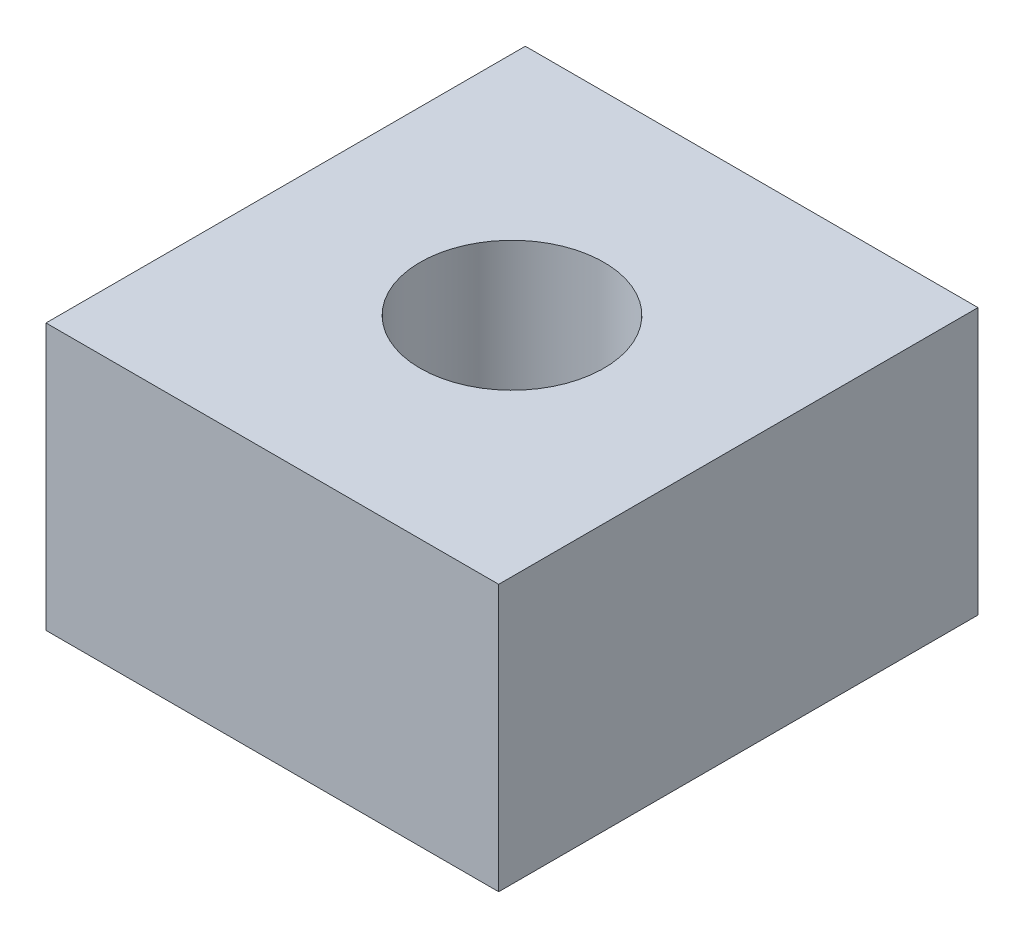
ISO-10303-21;
HEADER;
FILE_DESCRIPTION(('STEP AP214'),'2;1');
FILE_NAME('part.step','',(''),(''),'','','');
FILE_SCHEMA(('AUTOMOTIVE_DESIGN { 1 0 10303 214 1 1 1 1 }'));
ENDSEC;
DATA;
#1=APPLICATION_CONTEXT('core data for automotive mechanical design processes');
#2=APPLICATION_PROTOCOL_DEFINITION('international standard','automotive_design',2000,#1);
#3=PRODUCT_CONTEXT('',#1,'mechanical');
#4=PRODUCT('Part','Part','',(#3));
#5=PRODUCT_RELATED_PRODUCT_CATEGORY('part','',(#4));
#6=PRODUCT_DEFINITION_FORMATION('','',#4);
#7=PRODUCT_DEFINITION_CONTEXT('part definition',#1,'design');
#8=PRODUCT_DEFINITION('design','',#6,#7);
#9=PRODUCT_DEFINITION_SHAPE('','',#8);
#10=(LENGTH_UNIT() NAMED_UNIT(*) SI_UNIT(.MILLI.,.METRE.));
#11=(NAMED_UNIT(*) PLANE_ANGLE_UNIT() SI_UNIT($,.RADIAN.));
#12=(NAMED_UNIT(*) SI_UNIT($,.STERADIAN.) SOLID_ANGLE_UNIT());
#13=UNCERTAINTY_MEASURE_WITH_UNIT(LENGTH_MEASURE(1.E-05),#10,'distance_accuracy_value','');
#14=(GEOMETRIC_REPRESENTATION_CONTEXT(3) GLOBAL_UNCERTAINTY_ASSIGNED_CONTEXT((#13)) GLOBAL_UNIT_ASSIGNED_CONTEXT((#10,
#11,#12)) REPRESENTATION_CONTEXT('',''));
#15=CARTESIAN_POINT('',(0.,0.,0.));
#16=DIRECTION('',(0.,0.,1.));
#17=DIRECTION('',(1.,0.,0.));
#18=AXIS2_PLACEMENT_3D('',#15,#16,#17);
#19=CARTESIAN_POINT('',(0.,10.,0.));
#20=DIRECTION('',(1.,0.,0.));
#21=DIRECTION('',(0.,0.,-1.));
#22=AXIS2_PLACEMENT_3D('',#19,#20,#21);
#23=PLANE('',#22);
#24=DIRECTION('',(0.,0.,1.));
#25=VECTOR('',#24,1.);
#26=CARTESIAN_POINT('',(0.,0.,0.));
#27=LINE('',#26,#25);
#28=CARTESIAN_POINT('',(0.,0.,-18.));
#29=VERTEX_POINT('',#28);
#30=CARTESIAN_POINT('',(0.,0.,0.));
#31=VERTEX_POINT('',#30);
#32=EDGE_CURVE('E97',#29,#31,#27,.T.);
#33=ORIENTED_EDGE('',*,*,#32,.T.);
#34=DIRECTION('',(0.,-1.,0.));
#35=VECTOR('',#34,1.);
#36=CARTESIAN_POINT('',(0.,10.,0.));
#37=LINE('',#36,#35);
#38=CARTESIAN_POINT('',(0.,10.,0.));
#39=VERTEX_POINT('',#38);
#40=EDGE_CURVE('E11',#39,#31,#37,.T.);
#41=ORIENTED_EDGE('',*,*,#40,.F.);
#42=DIRECTION('',(0.,0.,1.));
#43=VECTOR('',#42,1.);
#44=CARTESIAN_POINT('',(0.,10.,0.));
#45=LINE('',#44,#43);
#46=CARTESIAN_POINT('',(0.,10.,-18.));
#47=VERTEX_POINT('',#46);
#48=EDGE_CURVE('E85',#47,#39,#45,.T.);
#49=ORIENTED_EDGE('',*,*,#48,.F.);
#50=DIRECTION('',(0.,-1.,0.));
#51=VECTOR('',#50,1.);
#52=CARTESIAN_POINT('',(0.,10.,-18.));
#53=LINE('',#52,#51);
#54=EDGE_CURVE('E93',#47,#29,#53,.T.);
#55=ORIENTED_EDGE('',*,*,#54,.T.);
#56=EDGE_LOOP('',(#33,#41,#49,#55));
#57=FACE_BOUND('',#56,.T.);
#58=ADVANCED_FACE('F34',(#57),#23,.F.);
#59=CARTESIAN_POINT('',(0.,10.,0.));
#60=DIRECTION('',(0.,0.,-1.));
#61=DIRECTION('',(-1.,0.,0.));
#62=AXIS2_PLACEMENT_3D('',#59,#60,#61);
#63=PLANE('',#62);
#64=DIRECTION('',(1.,0.,0.));
#65=VECTOR('',#64,1.);
#66=CARTESIAN_POINT('',(0.,0.,0.));
#67=LINE('',#66,#65);
#68=CARTESIAN_POINT('',(17.,0.,0.));
#69=VERTEX_POINT('',#68);
#70=EDGE_CURVE('E89',#31,#69,#67,.T.);
#71=ORIENTED_EDGE('',*,*,#70,.T.);
#72=DIRECTION('',(0.,-1.,0.));
#73=VECTOR('',#72,1.);
#74=CARTESIAN_POINT('',(17.,10.,0.));
#75=LINE('',#74,#73);
#76=CARTESIAN_POINT('',(17.,10.,0.));
#77=VERTEX_POINT('',#76);
#78=EDGE_CURVE('E42',#77,#69,#75,.T.);
#79=ORIENTED_EDGE('',*,*,#78,.F.);
#80=DIRECTION('',(1.,0.,0.));
#81=VECTOR('',#80,1.);
#82=CARTESIAN_POINT('',(0.,10.,0.));
#83=LINE('',#82,#81);
#84=EDGE_CURVE('E80',#39,#77,#83,.T.);
#85=ORIENTED_EDGE('',*,*,#84,.F.);
#86=ORIENTED_EDGE('',*,*,#40,.T.);
#87=EDGE_LOOP('',(#71,#79,#85,#86));
#88=FACE_BOUND('',#87,.T.);
#89=ADVANCED_FACE('F88',(#88),#63,.F.);
#90=CARTESIAN_POINT('',(17.,10.,0.));
#91=DIRECTION('',(-1.,0.,0.));
#92=DIRECTION('',(0.,0.,1.));
#93=AXIS2_PLACEMENT_3D('',#90,#91,#92);
#94=PLANE('',#93);
#95=DIRECTION('',(0.,0.,-1.));
#96=VECTOR('',#95,1.);
#97=CARTESIAN_POINT('',(17.,0.,0.));
#98=LINE('',#97,#96);
#99=CARTESIAN_POINT('',(17.,0.,-18.));
#100=VERTEX_POINT('',#99);
#101=EDGE_CURVE('E67',#69,#100,#98,.T.);
#102=ORIENTED_EDGE('',*,*,#101,.T.);
#103=DIRECTION('',(0.,-1.,0.));
#104=VECTOR('',#103,1.);
#105=CARTESIAN_POINT('',(17.,10.,-18.));
#106=LINE('',#105,#104);
#107=CARTESIAN_POINT('',(17.,10.,-18.));
#108=VERTEX_POINT('',#107);
#109=EDGE_CURVE('E90',#108,#100,#106,.T.);
#110=ORIENTED_EDGE('',*,*,#109,.F.);
#111=DIRECTION('',(0.,0.,-1.));
#112=VECTOR('',#111,1.);
#113=CARTESIAN_POINT('',(17.,10.,0.));
#114=LINE('',#113,#112);
#115=EDGE_CURVE('E83',#77,#108,#114,.T.);
#116=ORIENTED_EDGE('',*,*,#115,.F.);
#117=ORIENTED_EDGE('',*,*,#78,.T.);
#118=EDGE_LOOP('',(#102,#110,#116,#117));
#119=FACE_BOUND('',#118,.T.);
#120=ADVANCED_FACE('F91',(#119),#94,.F.);
#121=CARTESIAN_POINT('',(0.,10.,-18.));
#122=DIRECTION('',(0.,0.,1.));
#123=DIRECTION('',(1.,0.,0.));
#124=AXIS2_PLACEMENT_3D('',#121,#122,#123);
#125=PLANE('',#124);
#126=DIRECTION('',(-1.,0.,0.));
#127=VECTOR('',#126,1.);
#128=CARTESIAN_POINT('',(0.,0.,-18.));
#129=LINE('',#128,#127);
#130=EDGE_CURVE('E73',#100,#29,#129,.T.);
#131=ORIENTED_EDGE('',*,*,#130,.T.);
#132=ORIENTED_EDGE('',*,*,#54,.F.);
#133=DIRECTION('',(-1.,0.,0.));
#134=VECTOR('',#133,1.);
#135=CARTESIAN_POINT('',(0.,10.,-18.));
#136=LINE('',#135,#134);
#137=EDGE_CURVE('E50',#108,#47,#136,.T.);
#138=ORIENTED_EDGE('',*,*,#137,.F.);
#139=ORIENTED_EDGE('',*,*,#109,.T.);
#140=EDGE_LOOP('',(#131,#132,#138,#139));
#141=FACE_BOUND('',#140,.T.);
#142=ADVANCED_FACE('F105',(#141),#125,.F.);
#143=CARTESIAN_POINT('',(0.,10.,0.));
#144=DIRECTION('',(0.,-1.,0.));
#145=DIRECTION('',(0.,0.,-1.));
#146=AXIS2_PLACEMENT_3D('',#143,#144,#145);
#147=PLANE('',#146);
#148=CARTESIAN_POINT('',(8.5,10.,-9.));
#149=DIRECTION('',(0.,1.,0.));
#150=DIRECTION('',(0.,0.,1.));
#151=AXIS2_PLACEMENT_3D('',#148,#149,#150);
#152=CIRCLE('',#151,3.45);
#153=CARTESIAN_POINT('',(8.5,10.,-5.55));
#154=VERTEX_POINT('',#153);
#155=EDGE_CURVE('E111',#154,#154,#152,.T.);
#156=ORIENTED_EDGE('',*,*,#155,.F.);
#157=EDGE_LOOP('',(#156));
#158=FACE_BOUND('',#157,.T.);
#159=ORIENTED_EDGE('',*,*,#48,.T.);
#160=ORIENTED_EDGE('',*,*,#84,.T.);
#161=ORIENTED_EDGE('',*,*,#115,.T.);
#162=ORIENTED_EDGE('',*,*,#137,.T.);
#163=EDGE_LOOP('',(#159,#160,#161,#162));
#164=FACE_BOUND('',#163,.T.);
#165=ADVANCED_FACE('F81',(#158,#164),#147,.F.);
#166=CARTESIAN_POINT('',(0.,0.,0.));
#167=DIRECTION('',(0.,-1.,0.));
#168=DIRECTION('',(0.,0.,-1.));
#169=AXIS2_PLACEMENT_3D('',#166,#167,#168);
#170=PLANE('',#169);
#171=CARTESIAN_POINT('',(8.5,0.,-9.));
#172=DIRECTION('',(0.,1.,0.));
#173=DIRECTION('',(0.,0.,1.));
#174=AXIS2_PLACEMENT_3D('',#171,#172,#173);
#175=CIRCLE('',#174,3.45);
#176=CARTESIAN_POINT('',(8.5,0.,-5.55));
#177=VERTEX_POINT('',#176);
#178=EDGE_CURVE('E100',#177,#177,#175,.T.);
#179=ORIENTED_EDGE('',*,*,#178,.T.);
#180=EDGE_LOOP('',(#179));
#181=FACE_BOUND('',#180,.T.);
#182=ORIENTED_EDGE('',*,*,#32,.F.);
#183=ORIENTED_EDGE('',*,*,#130,.F.);
#184=ORIENTED_EDGE('',*,*,#101,.F.);
#185=ORIENTED_EDGE('',*,*,#70,.F.);
#186=EDGE_LOOP('',(#182,#183,#184,#185));
#187=FACE_BOUND('',#186,.T.);
#188=ADVANCED_FACE('F108',(#181,#187),#170,.T.);
#189=CARTESIAN_POINT('',(8.5,0.,-9.));
#190=DIRECTION('',(0.,1.,0.));
#191=DIRECTION('',(0.,0.,1.));
#192=AXIS2_PLACEMENT_3D('',#189,#190,#191);
#193=CYLINDRICAL_SURFACE('',#192,3.45);
#194=ORIENTED_EDGE('',*,*,#178,.F.);
#195=EDGE_LOOP('',(#194));
#196=FACE_BOUND('',#195,.T.);
#197=ORIENTED_EDGE('',*,*,#155,.T.);
#198=EDGE_LOOP('',(#197));
#199=FACE_BOUND('',#198,.T.);
#200=ADVANCED_FACE('F118',(#196,#199),#193,.F.);
#201=CLOSED_SHELL('',(#58,#89,#120,#142,#165,#188,#200));
#202=MANIFOLD_SOLID_BREP('B2',#201);
#203=ADVANCED_BREP_SHAPE_REPRESENTATION('',(#18,#202),#14);
#204=SHAPE_DEFINITION_REPRESENTATION(#9,#203);
ENDSEC;
END-ISO-10303-21;
